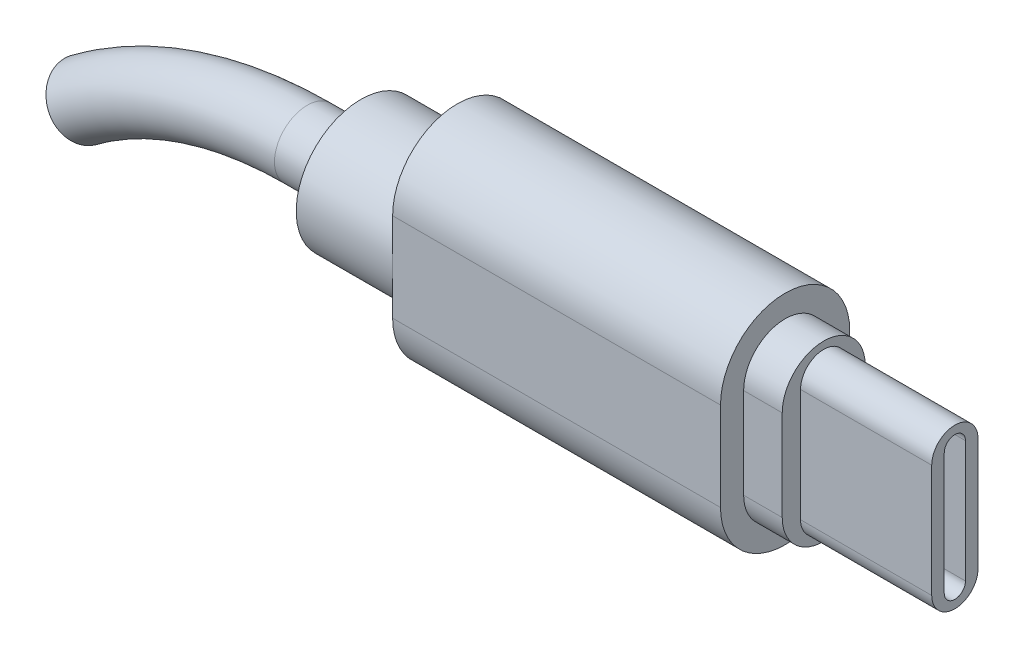
ISO-10303-21;
HEADER;
FILE_DESCRIPTION(('STEP AP214'),'2;1');
FILE_NAME('part.step','',(''),(''),'','','');
FILE_SCHEMA(('AUTOMOTIVE_DESIGN { 1 0 10303 214 1 1 1 1 }'));
ENDSEC;
DATA;
#1=APPLICATION_CONTEXT('core data for automotive mechanical design processes');
#2=APPLICATION_PROTOCOL_DEFINITION('international standard','automotive_design',2000,#1);
#3=PRODUCT_CONTEXT('',#1,'mechanical');
#4=PRODUCT('Part','Part','',(#3));
#5=PRODUCT_RELATED_PRODUCT_CATEGORY('part','',(#4));
#6=PRODUCT_DEFINITION_FORMATION('','',#4);
#7=PRODUCT_DEFINITION_CONTEXT('part definition',#1,'design');
#8=PRODUCT_DEFINITION('design','',#6,#7);
#9=PRODUCT_DEFINITION_SHAPE('','',#8);
#10=(LENGTH_UNIT() NAMED_UNIT(*) SI_UNIT(.MILLI.,.METRE.));
#11=(NAMED_UNIT(*) PLANE_ANGLE_UNIT() SI_UNIT($,.RADIAN.));
#12=(NAMED_UNIT(*) SI_UNIT($,.STERADIAN.) SOLID_ANGLE_UNIT());
#13=UNCERTAINTY_MEASURE_WITH_UNIT(LENGTH_MEASURE(1.E-05),#10,'distance_accuracy_value','');
#14=(GEOMETRIC_REPRESENTATION_CONTEXT(3) GLOBAL_UNCERTAINTY_ASSIGNED_CONTEXT((#13)) GLOBAL_UNIT_ASSIGNED_CONTEXT((#10,
#11,#12)) REPRESENTATION_CONTEXT('',''));
#15=CARTESIAN_POINT('',(0.,0.,0.));
#16=DIRECTION('',(0.,0.,1.));
#17=DIRECTION('',(1.,0.,0.));
#18=AXIS2_PLACEMENT_3D('',#15,#16,#17);
#19=CARTESIAN_POINT('',(8.8,-2.925,0.));
#20=DIRECTION('',(1.,0.,0.));
#21=DIRECTION('',(0.,0.,-1.));
#22=AXIS2_PLACEMENT_3D('',#19,#20,#21);
#23=PLANE('',#22);
#24=CARTESIAN_POINT('',(8.8,-2.925,0.));
#25=DIRECTION('',(1.,0.,0.));
#26=DIRECTION('',(0.,0.,-1.));
#27=AXIS2_PLACEMENT_3D('',#24,#25,#26);
#28=CIRCLE('',#27,1.2);
#29=CARTESIAN_POINT('',(8.8,-2.925,1.2));
#30=VERTEX_POINT('',#29);
#31=CARTESIAN_POINT('',(8.8,-2.925,-1.2));
#32=VERTEX_POINT('',#31);
#33=EDGE_CURVE('E187',#30,#32,#28,.T.);
#34=ORIENTED_EDGE('',*,*,#33,.T.);
#35=DIRECTION('',(0.,1.,0.));
#36=VECTOR('',#35,1.);
#37=CARTESIAN_POINT('',(8.8,-2.925,-1.2));
#38=LINE('',#37,#36);
#39=CARTESIAN_POINT('',(8.8,2.925,-1.2));
#40=VERTEX_POINT('',#39);
#41=EDGE_CURVE('E190',#32,#40,#38,.T.);
#42=ORIENTED_EDGE('',*,*,#41,.T.);
#43=CARTESIAN_POINT('',(8.8,2.925,0.));
#44=DIRECTION('',(1.,0.,0.));
#45=DIRECTION('',(0.,0.,-1.));
#46=AXIS2_PLACEMENT_3D('',#43,#44,#45);
#47=CIRCLE('',#46,1.2);
#48=CARTESIAN_POINT('',(8.8,2.925,1.2));
#49=VERTEX_POINT('',#48);
#50=EDGE_CURVE('E193',#40,#49,#47,.T.);
#51=ORIENTED_EDGE('',*,*,#50,.T.);
#52=DIRECTION('',(0.,-1.,0.));
#53=VECTOR('',#52,1.);
#54=CARTESIAN_POINT('',(8.8,-2.925,1.2));
#55=LINE('',#54,#53);
#56=EDGE_CURVE('E195',#49,#30,#55,.T.);
#57=ORIENTED_EDGE('',*,*,#56,.T.);
#58=EDGE_LOOP('',(#34,#42,#51,#57));
#59=FACE_BOUND('',#58,.T.);
#60=DIRECTION('',(0.,-1.,0.));
#61=VECTOR('',#60,1.);
#62=CARTESIAN_POINT('',(8.8,-3.15,-0.55));
#63=LINE('',#62,#61);
#64=CARTESIAN_POINT('',(8.8,3.15,-0.549999999999998));
#65=VERTEX_POINT('',#64);
#66=CARTESIAN_POINT('',(8.8,-3.15,-0.55));
#67=VERTEX_POINT('',#66);
#68=EDGE_CURVE('E174',#65,#67,#63,.T.);
#69=ORIENTED_EDGE('',*,*,#68,.T.);
#70=CARTESIAN_POINT('',(8.8,-3.15,0.));
#71=DIRECTION('',(-1.,0.,0.));
#72=DIRECTION('',(0.,0.,1.));
#73=AXIS2_PLACEMENT_3D('',#70,#71,#72);
#74=CIRCLE('',#73,0.55);
#75=CARTESIAN_POINT('',(8.8,-3.15,0.55));
#76=VERTEX_POINT('',#75);
#77=EDGE_CURVE('E52',#67,#76,#74,.T.);
#78=ORIENTED_EDGE('',*,*,#77,.T.);
#79=DIRECTION('',(0.,1.,0.));
#80=VECTOR('',#79,1.);
#81=CARTESIAN_POINT('',(8.8,-3.15,0.55));
#82=LINE('',#81,#80);
#83=CARTESIAN_POINT('',(8.8,3.15,0.55));
#84=VERTEX_POINT('',#83);
#85=EDGE_CURVE('E178',#76,#84,#82,.T.);
#86=ORIENTED_EDGE('',*,*,#85,.T.);
#87=CARTESIAN_POINT('',(8.8,3.15,0.));
#88=DIRECTION('',(-1.,0.,0.));
#89=DIRECTION('',(0.,0.,1.));
#90=AXIS2_PLACEMENT_3D('',#87,#88,#89);
#91=CIRCLE('',#90,0.55);
#92=EDGE_CURVE('E594',#84,#65,#91,.T.);
#93=ORIENTED_EDGE('',*,*,#92,.T.);
#94=EDGE_LOOP('',(#69,#78,#86,#93));
#95=FACE_BOUND('',#94,.T.);
#96=ADVANCED_FACE('F35',(#59,#95),#23,.T.);
#97=CARTESIAN_POINT('',(2.,2.35,0.));
#98=DIRECTION('',(-1.,0.,0.));
#99=DIRECTION('',(0.,0.,1.));
#100=AXIS2_PLACEMENT_3D('',#97,#98,#99);
#101=PLANE('',#100);
#102=CARTESIAN_POINT('',(2.,2.35,0.));
#103=DIRECTION('',(-1.,0.,0.));
#104=DIRECTION('',(0.,0.,1.));
#105=AXIS2_PLACEMENT_3D('',#102,#103,#104);
#106=CIRCLE('',#105,2.15);
#107=CARTESIAN_POINT('',(2.,2.35,2.15));
#108=VERTEX_POINT('',#107);
#109=CARTESIAN_POINT('',(2.,2.35,-2.15));
#110=VERTEX_POINT('',#109);
#111=EDGE_CURVE('E227',#108,#110,#106,.T.);
#112=ORIENTED_EDGE('',*,*,#111,.F.);
#113=DIRECTION('',(0.,1.,0.));
#114=VECTOR('',#113,1.);
#115=CARTESIAN_POINT('',(2.,2.35,2.15));
#116=LINE('',#115,#114);
#117=CARTESIAN_POINT('',(2.,-2.35,2.15));
#118=VERTEX_POINT('',#117);
#119=EDGE_CURVE('E237',#118,#108,#116,.T.);
#120=ORIENTED_EDGE('',*,*,#119,.F.);
#121=CARTESIAN_POINT('',(2.,-2.35,0.));
#122=DIRECTION('',(-1.,0.,0.));
#123=DIRECTION('',(0.,0.,1.));
#124=AXIS2_PLACEMENT_3D('',#121,#122,#123);
#125=CIRCLE('',#124,2.15);
#126=CARTESIAN_POINT('',(2.,-2.35,-2.15));
#127=VERTEX_POINT('',#126);
#128=EDGE_CURVE('E234',#127,#118,#125,.T.);
#129=ORIENTED_EDGE('',*,*,#128,.F.);
#130=DIRECTION('',(0.,-1.,0.));
#131=VECTOR('',#130,1.);
#132=CARTESIAN_POINT('',(2.,2.35,-2.15));
#133=LINE('',#132,#131);
#134=EDGE_CURVE('E230',#110,#127,#133,.T.);
#135=ORIENTED_EDGE('',*,*,#134,.F.);
#136=EDGE_LOOP('',(#112,#120,#129,#135));
#137=FACE_BOUND('',#136,.T.);
#138=CARTESIAN_POINT('',(2.,-2.925,0.));
#139=DIRECTION('',(1.,0.,0.));
#140=DIRECTION('',(0.,0.,-1.));
#141=AXIS2_PLACEMENT_3D('',#138,#139,#140);
#142=CIRCLE('',#141,1.2);
#143=CARTESIAN_POINT('',(2.,-2.925,1.2));
#144=VERTEX_POINT('',#143);
#145=CARTESIAN_POINT('',(2.,-2.925,-1.2));
#146=VERTEX_POINT('',#145);
#147=EDGE_CURVE('E60',#144,#146,#142,.T.);
#148=ORIENTED_EDGE('',*,*,#147,.F.);
#149=DIRECTION('',(0.,-1.,0.));
#150=VECTOR('',#149,1.);
#151=CARTESIAN_POINT('',(2.,-2.925,1.2));
#152=LINE('',#151,#150);
#153=CARTESIAN_POINT('',(2.,2.925,1.2));
#154=VERTEX_POINT('',#153);
#155=EDGE_CURVE('E191',#154,#144,#152,.T.);
#156=ORIENTED_EDGE('',*,*,#155,.F.);
#157=CARTESIAN_POINT('',(2.,2.925,0.));
#158=DIRECTION('',(1.,0.,0.));
#159=DIRECTION('',(0.,0.,-1.));
#160=AXIS2_PLACEMENT_3D('',#157,#158,#159);
#161=CIRCLE('',#160,1.2);
#162=CARTESIAN_POINT('',(2.,2.925,-1.2));
#163=VERTEX_POINT('',#162);
#164=EDGE_CURVE('E200',#163,#154,#161,.T.);
#165=ORIENTED_EDGE('',*,*,#164,.F.);
#166=DIRECTION('',(0.,1.,0.));
#167=VECTOR('',#166,1.);
#168=CARTESIAN_POINT('',(2.,-2.925,-1.2));
#169=LINE('',#168,#167);
#170=EDGE_CURVE('E181',#146,#163,#169,.T.);
#171=ORIENTED_EDGE('',*,*,#170,.F.);
#172=EDGE_LOOP('',(#148,#156,#165,#171));
#173=FACE_BOUND('',#172,.T.);
#174=ADVANCED_FACE('F336',(#137,#173),#101,.F.);
#175=CARTESIAN_POINT('',(-17.,-2.3,0.));
#176=DIRECTION('',(1.,0.,0.));
#177=DIRECTION('',(0.,0.,-1.));
#178=AXIS2_PLACEMENT_3D('',#175,#176,#177);
#179=PLANE('',#178);
#180=DIRECTION('',(0.,1.,0.));
#181=VECTOR('',#180,1.);
#182=CARTESIAN_POINT('',(-17.,-2.3,-3.35));
#183=LINE('',#182,#181);
#184=CARTESIAN_POINT('',(-17.,0.,-3.35));
#185=VERTEX_POINT('',#184);
#186=CARTESIAN_POINT('',(-17.,2.3,-3.35));
#187=VERTEX_POINT('',#186);
#188=EDGE_CURVE('E263',#185,#187,#183,.T.);
#189=ORIENTED_EDGE('',*,*,#188,.F.);
#190=CARTESIAN_POINT('',(-17.,0.,0.));
#191=DIRECTION('',(1.,0.,0.));
#192=DIRECTION('',(0.,0.,-1.));
#193=AXIS2_PLACEMENT_3D('',#190,#191,#192);
#194=CIRCLE('',#193,3.35);
#195=CARTESIAN_POINT('',(-17.,0.,3.35));
#196=VERTEX_POINT('',#195);
#197=EDGE_CURVE('E220',#185,#196,#194,.T.);
#198=ORIENTED_EDGE('',*,*,#197,.T.);
#199=DIRECTION('',(0.,-1.,0.));
#200=VECTOR('',#199,1.);
#201=CARTESIAN_POINT('',(-17.,-2.3,3.35));
#202=LINE('',#201,#200);
#203=CARTESIAN_POINT('',(-17.,2.3,3.35));
#204=VERTEX_POINT('',#203);
#205=EDGE_CURVE('E272',#204,#196,#202,.T.);
#206=ORIENTED_EDGE('',*,*,#205,.F.);
#207=CARTESIAN_POINT('',(-17.,2.3,0.));
#208=DIRECTION('',(1.,0.,0.));
#209=DIRECTION('',(0.,0.,-1.));
#210=AXIS2_PLACEMENT_3D('',#207,#208,#209);
#211=CIRCLE('',#210,3.35);
#212=EDGE_CURVE('E268',#187,#204,#211,.T.);
#213=ORIENTED_EDGE('',*,*,#212,.F.);
#214=EDGE_LOOP('',(#189,#198,#206,#213));
#215=FACE_BOUND('',#214,.T.);
#216=ADVANCED_FACE('F315',(#215),#179,.F.);
#217=CARTESIAN_POINT('',(0.,-2.3,0.));
#218=DIRECTION('',(1.,0.,0.));
#219=DIRECTION('',(0.,0.,-1.));
#220=AXIS2_PLACEMENT_3D('',#217,#218,#219);
#221=PLANE('',#220);
#222=CARTESIAN_POINT('',(0.,-2.3,0.));
#223=DIRECTION('',(1.,0.,0.));
#224=DIRECTION('',(0.,0.,-1.));
#225=AXIS2_PLACEMENT_3D('',#222,#223,#224);
#226=CIRCLE('',#225,3.35);
#227=CARTESIAN_POINT('',(0.,-2.3,3.35));
#228=VERTEX_POINT('',#227);
#229=CARTESIAN_POINT('',(0.,-2.3,-3.35));
#230=VERTEX_POINT('',#229);
#231=EDGE_CURVE('E254',#228,#230,#226,.T.);
#232=ORIENTED_EDGE('',*,*,#231,.T.);
#233=DIRECTION('',(0.,1.,0.));
#234=VECTOR('',#233,1.);
#235=CARTESIAN_POINT('',(0.,-2.3,-3.35));
#236=LINE('',#235,#234);
#237=CARTESIAN_POINT('',(0.,2.3,-3.35));
#238=VERTEX_POINT('',#237);
#239=EDGE_CURVE('E277',#230,#238,#236,.T.);
#240=ORIENTED_EDGE('',*,*,#239,.T.);
#241=CARTESIAN_POINT('',(0.,2.3,0.));
#242=DIRECTION('',(1.,0.,0.));
#243=DIRECTION('',(0.,0.,-1.));
#244=AXIS2_PLACEMENT_3D('',#241,#242,#243);
#245=CIRCLE('',#244,3.35);
#246=CARTESIAN_POINT('',(0.,2.3,3.35));
#247=VERTEX_POINT('',#246);
#248=EDGE_CURVE('E280',#238,#247,#245,.T.);
#249=ORIENTED_EDGE('',*,*,#248,.T.);
#250=DIRECTION('',(0.,-1.,0.));
#251=VECTOR('',#250,1.);
#252=CARTESIAN_POINT('',(0.,-2.3,3.35));
#253=LINE('',#252,#251);
#254=EDGE_CURVE('E264',#247,#228,#253,.T.);
#255=ORIENTED_EDGE('',*,*,#254,.T.);
#256=EDGE_LOOP('',(#232,#240,#249,#255));
#257=FACE_BOUND('',#256,.T.);
#258=DIRECTION('',(0.,1.,0.));
#259=VECTOR('',#258,1.);
#260=CARTESIAN_POINT('',(0.,2.35,2.15));
#261=LINE('',#260,#259);
#262=CARTESIAN_POINT('',(0.,-2.35,2.15));
#263=VERTEX_POINT('',#262);
#264=CARTESIAN_POINT('',(0.,2.35,2.15));
#265=VERTEX_POINT('',#264);
#266=EDGE_CURVE('E231',#263,#265,#261,.T.);
#267=ORIENTED_EDGE('',*,*,#266,.T.);
#268=CARTESIAN_POINT('',(0.,2.35,0.));
#269=DIRECTION('',(-1.,0.,0.));
#270=DIRECTION('',(0.,0.,1.));
#271=AXIS2_PLACEMENT_3D('',#268,#269,#270);
#272=CIRCLE('',#271,2.15);
#273=CARTESIAN_POINT('',(0.,2.35,-2.15));
#274=VERTEX_POINT('',#273);
#275=EDGE_CURVE('E224',#265,#274,#272,.T.);
#276=ORIENTED_EDGE('',*,*,#275,.T.);
#277=DIRECTION('',(0.,-1.,0.));
#278=VECTOR('',#277,1.);
#279=CARTESIAN_POINT('',(0.,2.35,-2.15));
#280=LINE('',#279,#278);
#281=CARTESIAN_POINT('',(0.,-2.35,-2.15));
#282=VERTEX_POINT('',#281);
#283=EDGE_CURVE('E243',#274,#282,#280,.T.);
#284=ORIENTED_EDGE('',*,*,#283,.T.);
#285=CARTESIAN_POINT('',(0.,-2.35,0.));
#286=DIRECTION('',(-1.,0.,0.));
#287=DIRECTION('',(0.,0.,1.));
#288=AXIS2_PLACEMENT_3D('',#285,#286,#287);
#289=CIRCLE('',#288,2.15);
#290=EDGE_CURVE('E246',#282,#263,#289,.T.);
#291=ORIENTED_EDGE('',*,*,#290,.T.);
#292=EDGE_LOOP('',(#267,#276,#284,#291));
#293=FACE_BOUND('',#292,.T.);
#294=ADVANCED_FACE('F300',(#257,#293),#221,.T.);
#295=CARTESIAN_POINT('',(-17.,-2.3,0.));
#296=DIRECTION('',(1.,0.,0.));
#297=DIRECTION('',(0.,0.,-1.));
#298=AXIS2_PLACEMENT_3D('',#295,#296,#297);
#299=CYLINDRICAL_SURFACE('',#298,3.35);
#300=ORIENTED_EDGE('',*,*,#231,.F.);
#301=DIRECTION('',(1.,0.,0.));
#302=VECTOR('',#301,1.);
#303=CARTESIAN_POINT('',(-17.,-2.3,3.35));
#304=LINE('',#303,#302);
#305=CARTESIAN_POINT('',(-17.,-2.3,3.35));
#306=VERTEX_POINT('',#305);
#307=EDGE_CURVE('E285',#306,#228,#304,.T.);
#308=ORIENTED_EDGE('',*,*,#307,.F.);
#309=CARTESIAN_POINT('',(-17.,-2.3,0.));
#310=DIRECTION('',(1.,0.,0.));
#311=DIRECTION('',(0.,0.,-1.));
#312=AXIS2_PLACEMENT_3D('',#309,#310,#311);
#313=CIRCLE('',#312,3.35);
#314=CARTESIAN_POINT('',(-17.,-2.3,-3.35));
#315=VERTEX_POINT('',#314);
#316=EDGE_CURVE('E260',#306,#315,#313,.T.);
#317=ORIENTED_EDGE('',*,*,#316,.T.);
#318=DIRECTION('',(1.,0.,0.));
#319=VECTOR('',#318,1.);
#320=CARTESIAN_POINT('',(-17.,-2.3,-3.35));
#321=LINE('',#320,#319);
#322=EDGE_CURVE('E39',#315,#230,#321,.T.);
#323=ORIENTED_EDGE('',*,*,#322,.T.);
#324=EDGE_LOOP('',(#300,#308,#317,#323));
#325=FACE_BOUND('',#324,.T.);
#326=ADVANCED_FACE('F37',(#325),#299,.T.);
#327=CARTESIAN_POINT('',(-17.,-2.3,3.35));
#328=DIRECTION('',(0.,0.,1.));
#329=DIRECTION('',(0.,-1.,0.));
#330=AXIS2_PLACEMENT_3D('',#327,#328,#329);
#331=PLANE('',#330);
#332=ORIENTED_EDGE('',*,*,#254,.F.);
#333=DIRECTION('',(1.,0.,0.));
#334=VECTOR('',#333,1.);
#335=CARTESIAN_POINT('',(-17.,2.3,3.35));
#336=LINE('',#335,#334);
#337=EDGE_CURVE('E287',#204,#247,#336,.T.);
#338=ORIENTED_EDGE('',*,*,#337,.F.);
#339=ORIENTED_EDGE('',*,*,#205,.T.);
#340=EDGE_CURVE('E271',#196,#306,#202,.T.);
#341=ORIENTED_EDGE('',*,*,#340,.T.);
#342=ORIENTED_EDGE('',*,*,#307,.T.);
#343=EDGE_LOOP('',(#332,#338,#339,#341,#342));
#344=FACE_BOUND('',#343,.T.);
#345=ADVANCED_FACE('F304',(#344),#331,.T.);
#346=CARTESIAN_POINT('',(-17.,2.3,0.));
#347=DIRECTION('',(1.,0.,0.));
#348=DIRECTION('',(0.,0.,-1.));
#349=AXIS2_PLACEMENT_3D('',#346,#347,#348);
#350=CYLINDRICAL_SURFACE('',#349,3.35);
#351=ORIENTED_EDGE('',*,*,#248,.F.);
#352=DIRECTION('',(1.,0.,0.));
#353=VECTOR('',#352,1.);
#354=CARTESIAN_POINT('',(-17.,2.3,-3.35));
#355=LINE('',#354,#353);
#356=EDGE_CURVE('E288',#187,#238,#355,.T.);
#357=ORIENTED_EDGE('',*,*,#356,.F.);
#358=ORIENTED_EDGE('',*,*,#212,.T.);
#359=ORIENTED_EDGE('',*,*,#337,.T.);
#360=EDGE_LOOP('',(#351,#357,#358,#359));
#361=FACE_BOUND('',#360,.T.);
#362=ADVANCED_FACE('F313',(#361),#350,.T.);
#363=CARTESIAN_POINT('',(-17.,-2.3,-3.35));
#364=DIRECTION('',(0.,0.,-1.));
#365=DIRECTION('',(0.,1.,0.));
#366=AXIS2_PLACEMENT_3D('',#363,#364,#365);
#367=PLANE('',#366);
#368=ORIENTED_EDGE('',*,*,#239,.F.);
#369=ORIENTED_EDGE('',*,*,#322,.F.);
#370=EDGE_CURVE('E265',#315,#185,#183,.T.);
#371=ORIENTED_EDGE('',*,*,#370,.T.);
#372=ORIENTED_EDGE('',*,*,#188,.T.);
#373=ORIENTED_EDGE('',*,*,#356,.T.);
#374=EDGE_LOOP('',(#368,#369,#371,#372,#373));
#375=FACE_BOUND('',#374,.T.);
#376=ADVANCED_FACE('F298',(#375),#367,.T.);
#377=ORIENTED_EDGE('',*,*,#340,.F.);
#378=EDGE_CURVE('E44',#196,#185,#194,.T.);
#379=ORIENTED_EDGE('',*,*,#378,.T.);
#380=ORIENTED_EDGE('',*,*,#370,.F.);
#381=ORIENTED_EDGE('',*,*,#316,.F.);
#382=EDGE_LOOP('',(#377,#379,#380,#381));
#383=FACE_BOUND('',#382,.T.);
#384=ADVANCED_FACE('F307',(#383),#179,.F.);
#385=CARTESIAN_POINT('',(2.,2.35,0.));
#386=DIRECTION('',(-1.,0.,0.));
#387=DIRECTION('',(0.,0.,1.));
#388=AXIS2_PLACEMENT_3D('',#385,#386,#387);
#389=CYLINDRICAL_SURFACE('',#388,2.15);
#390=ORIENTED_EDGE('',*,*,#275,.F.);
#391=DIRECTION('',(-1.,0.,0.));
#392=VECTOR('',#391,1.);
#393=CARTESIAN_POINT('',(2.,2.35,2.15));
#394=LINE('',#393,#392);
#395=EDGE_CURVE('E251',#108,#265,#394,.T.);
#396=ORIENTED_EDGE('',*,*,#395,.F.);
#397=ORIENTED_EDGE('',*,*,#111,.T.);
#398=DIRECTION('',(-1.,0.,0.));
#399=VECTOR('',#398,1.);
#400=CARTESIAN_POINT('',(2.,2.35,-2.15));
#401=LINE('',#400,#399);
#402=EDGE_CURVE('E240',#110,#274,#401,.T.);
#403=ORIENTED_EDGE('',*,*,#402,.T.);
#404=EDGE_LOOP('',(#390,#396,#397,#403));
#405=FACE_BOUND('',#404,.T.);
#406=ADVANCED_FACE('F515',(#405),#389,.T.);
#407=CARTESIAN_POINT('',(2.,2.35,2.15));
#408=DIRECTION('',(0.,0.,1.));
#409=DIRECTION('',(1.,0.,0.));
#410=AXIS2_PLACEMENT_3D('',#407,#408,#409);
#411=PLANE('',#410);
#412=ORIENTED_EDGE('',*,*,#266,.F.);
#413=DIRECTION('',(-1.,0.,0.));
#414=VECTOR('',#413,1.);
#415=CARTESIAN_POINT('',(2.,-2.35,2.15));
#416=LINE('',#415,#414);
#417=EDGE_CURVE('E255',#118,#263,#416,.T.);
#418=ORIENTED_EDGE('',*,*,#417,.F.);
#419=ORIENTED_EDGE('',*,*,#119,.T.);
#420=ORIENTED_EDGE('',*,*,#395,.T.);
#421=EDGE_LOOP('',(#412,#418,#419,#420));
#422=FACE_BOUND('',#421,.T.);
#423=ADVANCED_FACE('F506',(#422),#411,.T.);
#424=CARTESIAN_POINT('',(2.,-2.35,0.));
#425=DIRECTION('',(-1.,0.,0.));
#426=DIRECTION('',(0.,0.,1.));
#427=AXIS2_PLACEMENT_3D('',#424,#425,#426);
#428=CYLINDRICAL_SURFACE('',#427,2.15);
#429=ORIENTED_EDGE('',*,*,#290,.F.);
#430=DIRECTION('',(-1.,0.,0.));
#431=VECTOR('',#430,1.);
#432=CARTESIAN_POINT('',(2.,-2.35,-2.15));
#433=LINE('',#432,#431);
#434=EDGE_CURVE('E257',#127,#282,#433,.T.);
#435=ORIENTED_EDGE('',*,*,#434,.F.);
#436=ORIENTED_EDGE('',*,*,#128,.T.);
#437=ORIENTED_EDGE('',*,*,#417,.T.);
#438=EDGE_LOOP('',(#429,#435,#436,#437));
#439=FACE_BOUND('',#438,.T.);
#440=ADVANCED_FACE('F331',(#439),#428,.T.);
#441=CARTESIAN_POINT('',(2.,2.35,-2.15));
#442=DIRECTION('',(0.,0.,-1.));
#443=DIRECTION('',(-1.,0.,0.));
#444=AXIS2_PLACEMENT_3D('',#441,#442,#443);
#445=PLANE('',#444);
#446=ORIENTED_EDGE('',*,*,#283,.F.);
#447=ORIENTED_EDGE('',*,*,#402,.F.);
#448=ORIENTED_EDGE('',*,*,#134,.T.);
#449=ORIENTED_EDGE('',*,*,#434,.T.);
#450=EDGE_LOOP('',(#446,#447,#448,#449));
#451=FACE_BOUND('',#450,.T.);
#452=ADVANCED_FACE('F320',(#451),#445,.T.);
#453=CARTESIAN_POINT('',(-22.,0.,0.));
#454=DIRECTION('',(1.,0.,0.));
#455=DIRECTION('',(0.,0.,-1.));
#456=AXIS2_PLACEMENT_3D('',#453,#454,#455);
#457=CYLINDRICAL_SURFACE('',#456,3.35);
#458=CARTESIAN_POINT('',(-22.,0.,0.));
#459=DIRECTION('',(1.,0.,0.));
#460=DIRECTION('',(0.,0.,-1.));
#461=AXIS2_PLACEMENT_3D('',#458,#459,#460);
#462=CIRCLE('',#461,3.35);
#463=CARTESIAN_POINT('',(-22.,0.,-3.35));
#464=VERTEX_POINT('',#463);
#465=EDGE_CURVE('E221',#464,#464,#462,.T.);
#466=ORIENTED_EDGE('',*,*,#465,.T.);
#467=EDGE_LOOP('',(#466));
#468=FACE_BOUND('',#467,.T.);
#469=ORIENTED_EDGE('',*,*,#197,.F.);
#470=ORIENTED_EDGE('',*,*,#378,.F.);
#471=EDGE_LOOP('',(#469,#470));
#472=FACE_BOUND('',#471,.T.);
#473=ADVANCED_FACE('F317',(#468,#472),#457,.T.);
#474=CARTESIAN_POINT('',(-22.,0.,0.));
#475=DIRECTION('',(1.,0.,0.));
#476=DIRECTION('',(0.,0.,-1.));
#477=AXIS2_PLACEMENT_3D('',#474,#475,#476);
#478=PLANE('',#477);
#479=CARTESIAN_POINT('',(-22.,0.,0.));
#480=DIRECTION('',(-1.,0.,0.));
#481=DIRECTION('',(0.,0.,1.));
#482=AXIS2_PLACEMENT_3D('',#479,#480,#481);
#483=CIRCLE('',#482,1.7);
#484=CARTESIAN_POINT('',(-22.,0.,1.7));
#485=VERTEX_POINT('',#484);
#486=EDGE_CURVE('E11',#485,#485,#483,.T.);
#487=ORIENTED_EDGE('',*,*,#486,.F.);
#488=EDGE_LOOP('',(#487));
#489=FACE_BOUND('',#488,.T.);
#490=ORIENTED_EDGE('',*,*,#465,.F.);
#491=EDGE_LOOP('',(#490));
#492=FACE_BOUND('',#491,.T.);
#493=ADVANCED_FACE('F319',(#489,#492),#478,.F.);
#494=CARTESIAN_POINT('',(-36.3421818285019,-3.84559105512494,0.));
#495=DIRECTION('',(-0.800909636192724,-0.598785232494622,0.));
#496=DIRECTION('',(0.,0.,1.));
#497=AXIS2_PLACEMENT_3D('',#494,#495,#496);
#498=PLANE('',#497);
#499=CARTESIAN_POINT('',(-36.3421818285019,-3.84559105512494,0.));
#500=DIRECTION('',(-0.800909636192724,-0.598785232494622,0.));
#501=DIRECTION('',(0.,0.,1.));
#502=AXIS2_PLACEMENT_3D('',#499,#500,#501);
#503=CIRCLE('',#502,1.7);
#504=CARTESIAN_POINT('',(-36.3421818285019,-3.84559105512494,1.7));
#505=VERTEX_POINT('',#504);
#506=EDGE_CURVE('E218',#505,#505,#503,.T.);
#507=ORIENTED_EDGE('',*,*,#506,.T.);
#508=EDGE_LOOP('',(#507));
#509=FACE_BOUND('',#508,.T.);
#510=ADVANCED_FACE('F327',(#509),#498,.T.);
#511=CARTESIAN_POINT('',(-22.,0.,0.));
#512=DIRECTION('',(-1.,0.,0.));
#513=DIRECTION('',(0.,0.,1.));
#514=AXIS2_PLACEMENT_3D('',#511,#512,#513);
#515=CYLINDRICAL_SURFACE('',#514,1.7);
#516=CARTESIAN_POINT('',(-24.7761618063009,0.,0.));
#517=DIRECTION('',(-1.,0.,0.));
#518=DIRECTION('',(0.,0.,1.));
#519=AXIS2_PLACEMENT_3D('',#516,#517,#518);
#520=CIRCLE('',#519,1.7);
#521=CARTESIAN_POINT('',(-24.7761618063009,0.,1.7));
#522=VERTEX_POINT('',#521);
#523=EDGE_CURVE('E214',#522,#522,#520,.T.);
#524=ORIENTED_EDGE('',*,*,#523,.F.);
#525=EDGE_LOOP('',(#524));
#526=FACE_BOUND('',#525,.T.);
#527=ORIENTED_EDGE('',*,*,#486,.T.);
#528=EDGE_LOOP('',(#527));
#529=FACE_BOUND('',#528,.T.);
#530=ADVANCED_FACE('F363',(#526,#529),#515,.T.);
#531=CARTESIAN_POINT('',(-24.7761618063009,-19.3158070615993,0.));
#532=DIRECTION('',(0.,0.,1.));
#533=DIRECTION('',(1.,0.,0.));
#534=AXIS2_PLACEMENT_3D('',#531,#532,#533);
#535=TOROIDAL_SURFACE('',#534,19.3158070615993,1.7);
#536=ORIENTED_EDGE('',*,*,#506,.F.);
#537=EDGE_LOOP('',(#536));
#538=FACE_BOUND('',#537,.T.);
#539=ORIENTED_EDGE('',*,*,#523,.T.);
#540=EDGE_LOOP('',(#539));
#541=FACE_BOUND('',#540,.T.);
#542=ADVANCED_FACE('F330',(#538,#541),#535,.T.);
#543=CARTESIAN_POINT('',(8.8,-2.925,0.));
#544=DIRECTION('',(-1.,0.,0.));
#545=DIRECTION('',(0.,0.,1.));
#546=AXIS2_PLACEMENT_3D('',#543,#544,#545);
#547=CYLINDRICAL_SURFACE('',#546,1.2);
#548=ORIENTED_EDGE('',*,*,#147,.T.);
#549=DIRECTION('',(-1.,0.,0.));
#550=VECTOR('',#549,1.);
#551=CARTESIAN_POINT('',(8.8,-2.925,-1.2));
#552=LINE('',#551,#550);
#553=EDGE_CURVE('E212',#32,#146,#552,.T.);
#554=ORIENTED_EDGE('',*,*,#553,.F.);
#555=ORIENTED_EDGE('',*,*,#33,.F.);
#556=DIRECTION('',(-1.,0.,0.));
#557=VECTOR('',#556,1.);
#558=CARTESIAN_POINT('',(8.8,-2.925,1.2));
#559=LINE('',#558,#557);
#560=EDGE_CURVE('E196',#30,#144,#559,.T.);
#561=ORIENTED_EDGE('',*,*,#560,.T.);
#562=EDGE_LOOP('',(#548,#554,#555,#561));
#563=FACE_BOUND('',#562,.T.);
#564=ADVANCED_FACE('F358',(#563),#547,.T.);
#565=CARTESIAN_POINT('',(8.8,-2.925,-1.2));
#566=DIRECTION('',(0.,0.,1.));
#567=DIRECTION('',(0.,-1.,0.));
#568=AXIS2_PLACEMENT_3D('',#565,#566,#567);
#569=PLANE('',#568);
#570=ORIENTED_EDGE('',*,*,#170,.T.);
#571=DIRECTION('',(-1.,0.,0.));
#572=VECTOR('',#571,1.);
#573=CARTESIAN_POINT('',(8.8,2.925,-1.2));
#574=LINE('',#573,#572);
#575=EDGE_CURVE('E209',#40,#163,#574,.T.);
#576=ORIENTED_EDGE('',*,*,#575,.F.);
#577=ORIENTED_EDGE('',*,*,#41,.F.);
#578=ORIENTED_EDGE('',*,*,#553,.T.);
#579=EDGE_LOOP('',(#570,#576,#577,#578));
#580=FACE_BOUND('',#579,.T.);
#581=ADVANCED_FACE('F354',(#580),#569,.F.);
#582=CARTESIAN_POINT('',(8.8,2.925,0.));
#583=DIRECTION('',(-1.,0.,0.));
#584=DIRECTION('',(0.,0.,1.));
#585=AXIS2_PLACEMENT_3D('',#582,#583,#584);
#586=CYLINDRICAL_SURFACE('',#585,1.2);
#587=ORIENTED_EDGE('',*,*,#164,.T.);
#588=DIRECTION('',(-1.,0.,0.));
#589=VECTOR('',#588,1.);
#590=CARTESIAN_POINT('',(8.8,2.925,1.2));
#591=LINE('',#590,#589);
#592=EDGE_CURVE('E206',#49,#154,#591,.T.);
#593=ORIENTED_EDGE('',*,*,#592,.F.);
#594=ORIENTED_EDGE('',*,*,#50,.F.);
#595=ORIENTED_EDGE('',*,*,#575,.T.);
#596=EDGE_LOOP('',(#587,#593,#594,#595));
#597=FACE_BOUND('',#596,.T.);
#598=ADVANCED_FACE('F350',(#597),#586,.T.);
#599=CARTESIAN_POINT('',(8.8,-2.925,1.2));
#600=DIRECTION('',(0.,0.,-1.));
#601=DIRECTION('',(0.,1.,0.));
#602=AXIS2_PLACEMENT_3D('',#599,#600,#601);
#603=PLANE('',#602);
#604=ORIENTED_EDGE('',*,*,#155,.T.);
#605=ORIENTED_EDGE('',*,*,#560,.F.);
#606=ORIENTED_EDGE('',*,*,#56,.F.);
#607=ORIENTED_EDGE('',*,*,#592,.T.);
#608=EDGE_LOOP('',(#604,#605,#606,#607));
#609=FACE_BOUND('',#608,.T.);
#610=ADVANCED_FACE('F347',(#609),#603,.F.);
#611=CARTESIAN_POINT('',(3.8,-3.15,0.));
#612=DIRECTION('',(1.,0.,0.));
#613=DIRECTION('',(0.,0.,-1.));
#614=AXIS2_PLACEMENT_3D('',#611,#612,#613);
#615=CYLINDRICAL_SURFACE('',#614,0.55);
#616=ORIENTED_EDGE('',*,*,#77,.F.);
#617=DIRECTION('',(1.,0.,0.));
#618=VECTOR('',#617,1.);
#619=CARTESIAN_POINT('',(3.8,-3.15,-0.55));
#620=LINE('',#619,#618);
#621=CARTESIAN_POINT('',(3.8,-3.15,-0.55));
#622=VERTEX_POINT('',#621);
#623=EDGE_CURVE('E173',#622,#67,#620,.T.);
#624=ORIENTED_EDGE('',*,*,#623,.F.);
#625=CARTESIAN_POINT('',(3.8,-3.15,0.));
#626=DIRECTION('',(-1.,0.,0.));
#627=DIRECTION('',(0.,0.,1.));
#628=AXIS2_PLACEMENT_3D('',#625,#626,#627);
#629=CIRCLE('',#628,0.55);
#630=CARTESIAN_POINT('',(3.8,-3.15,0.55));
#631=VERTEX_POINT('',#630);
#632=EDGE_CURVE('E165',#622,#631,#629,.T.);
#633=ORIENTED_EDGE('',*,*,#632,.T.);
#634=DIRECTION('',(1.,0.,0.));
#635=VECTOR('',#634,1.);
#636=CARTESIAN_POINT('',(3.8,-3.15,0.55));
#637=LINE('',#636,#635);
#638=EDGE_CURVE('E172',#631,#76,#637,.T.);
#639=ORIENTED_EDGE('',*,*,#638,.T.);
#640=EDGE_LOOP('',(#616,#624,#633,#639));
#641=FACE_BOUND('',#640,.T.);
#642=ADVANCED_FACE('F171',(#641),#615,.F.);
#643=CARTESIAN_POINT('',(3.8,-3.15,0.55));
#644=DIRECTION('',(0.,0.,-1.));
#645=DIRECTION('',(0.,1.,0.));
#646=AXIS2_PLACEMENT_3D('',#643,#644,#645);
#647=PLANE('',#646);
#648=ORIENTED_EDGE('',*,*,#85,.F.);
#649=ORIENTED_EDGE('',*,*,#638,.F.);
#650=DIRECTION('',(0.,1.,0.));
#651=VECTOR('',#650,1.);
#652=CARTESIAN_POINT('',(3.8,-3.15,0.55));
#653=LINE('',#652,#651);
#654=CARTESIAN_POINT('',(3.8,3.15,0.55));
#655=VERTEX_POINT('',#654);
#656=EDGE_CURVE('E161',#631,#655,#653,.T.);
#657=ORIENTED_EDGE('',*,*,#656,.T.);
#658=DIRECTION('',(1.,0.,0.));
#659=VECTOR('',#658,1.);
#660=CARTESIAN_POINT('',(3.8,3.15,0.55));
#661=LINE('',#660,#659);
#662=EDGE_CURVE('E179',#655,#84,#661,.T.);
#663=ORIENTED_EDGE('',*,*,#662,.T.);
#664=EDGE_LOOP('',(#648,#649,#657,#663));
#665=FACE_BOUND('',#664,.T.);
#666=ADVANCED_FACE('F176',(#665),#647,.T.);
#667=CARTESIAN_POINT('',(3.8,3.15,0.));
#668=DIRECTION('',(1.,0.,0.));
#669=DIRECTION('',(0.,0.,-1.));
#670=AXIS2_PLACEMENT_3D('',#667,#668,#669);
#671=CYLINDRICAL_SURFACE('',#670,0.55);
#672=ORIENTED_EDGE('',*,*,#92,.F.);
#673=ORIENTED_EDGE('',*,*,#662,.F.);
#674=CARTESIAN_POINT('',(3.8,3.15,0.));
#675=DIRECTION('',(-1.,0.,0.));
#676=DIRECTION('',(0.,0.,1.));
#677=AXIS2_PLACEMENT_3D('',#674,#675,#676);
#678=CIRCLE('',#677,0.55);
#679=CARTESIAN_POINT('',(3.8,3.15,-0.549999999999998));
#680=VERTEX_POINT('',#679);
#681=EDGE_CURVE('E166',#655,#680,#678,.T.);
#682=ORIENTED_EDGE('',*,*,#681,.T.);
#683=DIRECTION('',(1.,0.,0.));
#684=VECTOR('',#683,1.);
#685=CARTESIAN_POINT('',(3.8,3.15,-0.549999999999998));
#686=LINE('',#685,#684);
#687=EDGE_CURVE('E183',#680,#65,#686,.T.);
#688=ORIENTED_EDGE('',*,*,#687,.T.);
#689=EDGE_LOOP('',(#672,#673,#682,#688));
#690=FACE_BOUND('',#689,.T.);
#691=ADVANCED_FACE('F420',(#690),#671,.F.);
#692=CARTESIAN_POINT('',(3.8,-3.15,-0.55));
#693=DIRECTION('',(0.,0.,1.));
#694=DIRECTION('',(0.,-1.,0.));
#695=AXIS2_PLACEMENT_3D('',#692,#693,#694);
#696=PLANE('',#695);
#697=ORIENTED_EDGE('',*,*,#68,.F.);
#698=ORIENTED_EDGE('',*,*,#687,.F.);
#699=DIRECTION('',(0.,-1.,0.));
#700=VECTOR('',#699,1.);
#701=CARTESIAN_POINT('',(3.8,-3.15,-0.55));
#702=LINE('',#701,#700);
#703=EDGE_CURVE('E601',#680,#622,#702,.T.);
#704=ORIENTED_EDGE('',*,*,#703,.T.);
#705=ORIENTED_EDGE('',*,*,#623,.T.);
#706=EDGE_LOOP('',(#697,#698,#704,#705));
#707=FACE_BOUND('',#706,.T.);
#708=ADVANCED_FACE('F426',(#707),#696,.T.);
#709=CARTESIAN_POINT('',(3.8,-3.15,0.));
#710=DIRECTION('',(-1.,0.,0.));
#711=DIRECTION('',(0.,0.,1.));
#712=AXIS2_PLACEMENT_3D('',#709,#710,#711);
#713=PLANE('',#712);
#714=ORIENTED_EDGE('',*,*,#632,.F.);
#715=ORIENTED_EDGE('',*,*,#703,.F.);
#716=ORIENTED_EDGE('',*,*,#681,.F.);
#717=ORIENTED_EDGE('',*,*,#656,.F.);
#718=EDGE_LOOP('',(#714,#715,#716,#717));
#719=FACE_BOUND('',#718,.T.);
#720=ADVANCED_FACE('F163',(#719),#713,.F.);
#721=CLOSED_SHELL('',(#96,#174,#216,#294,#326,#345,#362,#376,#384,#406,#423,#440,#452,#473,#493,
#510,#530,#542,#564,#581,#598,#610,#642,#666,#691,#708,#720));
#722=MANIFOLD_SOLID_BREP('B2',#721);
#723=ADVANCED_BREP_SHAPE_REPRESENTATION('',(#18,#722),#14);
#724=SHAPE_DEFINITION_REPRESENTATION(#9,#723);
ENDSEC;
END-ISO-10303-21;
